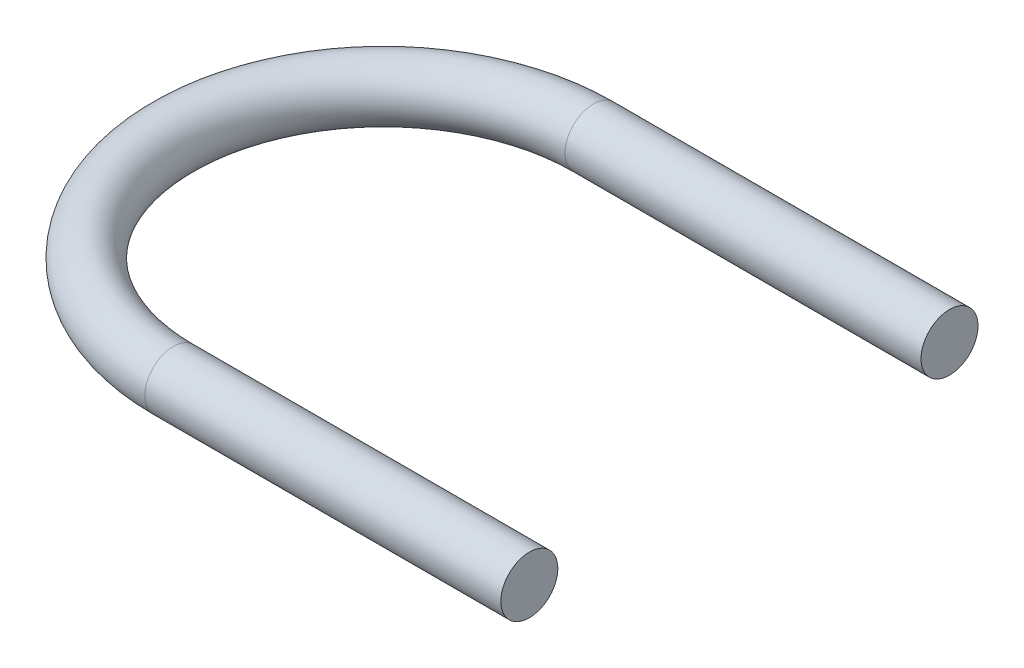
ISO-10303-21;
HEADER;
FILE_DESCRIPTION(('STEP AP214'),'2;1');
FILE_NAME('part.step','',(''),(''),'','','');
FILE_SCHEMA(('AUTOMOTIVE_DESIGN { 1 0 10303 214 1 1 1 1 }'));
ENDSEC;
DATA;
#1=APPLICATION_CONTEXT('core data for automotive mechanical design processes');
#2=APPLICATION_PROTOCOL_DEFINITION('international standard','automotive_design',2000,#1);
#3=PRODUCT_CONTEXT('',#1,'mechanical');
#4=PRODUCT('Part','Part','',(#3));
#5=PRODUCT_RELATED_PRODUCT_CATEGORY('part','',(#4));
#6=PRODUCT_DEFINITION_FORMATION('','',#4);
#7=PRODUCT_DEFINITION_CONTEXT('part definition',#1,'design');
#8=PRODUCT_DEFINITION('design','',#6,#7);
#9=PRODUCT_DEFINITION_SHAPE('','',#8);
#10=(LENGTH_UNIT() NAMED_UNIT(*) SI_UNIT(.MILLI.,.METRE.));
#11=(NAMED_UNIT(*) PLANE_ANGLE_UNIT() SI_UNIT($,.RADIAN.));
#12=(NAMED_UNIT(*) SI_UNIT($,.STERADIAN.) SOLID_ANGLE_UNIT());
#13=UNCERTAINTY_MEASURE_WITH_UNIT(LENGTH_MEASURE(1.E-05),#10,'distance_accuracy_value','');
#14=(GEOMETRIC_REPRESENTATION_CONTEXT(3) GLOBAL_UNCERTAINTY_ASSIGNED_CONTEXT((#13)) GLOBAL_UNIT_ASSIGNED_CONTEXT((#10,
#11,#12)) REPRESENTATION_CONTEXT('',''));
#15=CARTESIAN_POINT('',(0.,0.,0.));
#16=DIRECTION('',(0.,0.,1.));
#17=DIRECTION('',(1.,0.,0.));
#18=AXIS2_PLACEMENT_3D('',#15,#16,#17);
#19=CARTESIAN_POINT('',(50.,0.,-29.5));
#20=DIRECTION('',(1.,0.,0.));
#21=DIRECTION('',(0.,0.,-1.));
#22=AXIS2_PLACEMENT_3D('',#19,#20,#21);
#23=PLANE('',#22);
#24=CARTESIAN_POINT('',(50.,0.,-29.5));
#25=DIRECTION('',(1.,0.,0.));
#26=DIRECTION('',(0.,0.,-1.));
#27=AXIS2_PLACEMENT_3D('',#24,#25,#26);
#28=CIRCLE('',#27,4.);
#29=CARTESIAN_POINT('',(50.,0.,-33.5));
#30=VERTEX_POINT('',#29);
#31=EDGE_CURVE('E59',#30,#30,#28,.T.);
#32=ORIENTED_EDGE('',*,*,#31,.T.);
#33=EDGE_LOOP('',(#32));
#34=FACE_BOUND('',#33,.T.);
#35=ADVANCED_FACE('F47',(#34),#23,.T.);
#36=CARTESIAN_POINT('',(50.,0.,29.5));
#37=DIRECTION('',(-1.,0.,0.));
#38=DIRECTION('',(0.,0.,1.));
#39=AXIS2_PLACEMENT_3D('',#36,#37,#38);
#40=PLANE('',#39);
#41=CARTESIAN_POINT('',(50.,0.,29.5));
#42=DIRECTION('',(-1.,0.,0.));
#43=DIRECTION('',(0.,0.,1.));
#44=AXIS2_PLACEMENT_3D('',#41,#42,#43);
#45=CIRCLE('',#44,4.);
#46=CARTESIAN_POINT('',(50.,0.,33.5));
#47=VERTEX_POINT('',#46);
#48=EDGE_CURVE('E12',#47,#47,#45,.T.);
#49=ORIENTED_EDGE('',*,*,#48,.F.);
#50=EDGE_LOOP('',(#49));
#51=FACE_BOUND('',#50,.T.);
#52=ADVANCED_FACE('F65',(#51),#40,.F.);
#53=CARTESIAN_POINT('',(50.,0.,-29.5));
#54=DIRECTION('',(-1.,0.,0.));
#55=DIRECTION('',(0.,0.,1.));
#56=AXIS2_PLACEMENT_3D('',#53,#54,#55);
#57=CYLINDRICAL_SURFACE('',#56,4.);
#58=CARTESIAN_POINT('',(0.,0.,-29.5));
#59=DIRECTION('',(1.,0.,0.));
#60=DIRECTION('',(0.,0.,-1.));
#61=AXIS2_PLACEMENT_3D('',#58,#59,#60);
#62=CIRCLE('',#61,4.);
#63=CARTESIAN_POINT('',(0.,0.,-33.5));
#64=VERTEX_POINT('',#63);
#65=EDGE_CURVE('E90',#64,#64,#62,.T.);
#66=ORIENTED_EDGE('',*,*,#65,.T.);
#67=EDGE_LOOP('',(#66));
#68=FACE_BOUND('',#67,.T.);
#69=ORIENTED_EDGE('',*,*,#31,.F.);
#70=EDGE_LOOP('',(#69));
#71=FACE_BOUND('',#70,.T.);
#72=ADVANCED_FACE('F67',(#68,#71),#57,.T.);
#73=CARTESIAN_POINT('',(0.,0.,0.));
#74=DIRECTION('',(0.,1.,0.));
#75=DIRECTION('',(0.,0.,1.));
#76=AXIS2_PLACEMENT_3D('',#73,#74,#75);
#77=TOROIDAL_SURFACE('',#76,29.5,4.);
#78=CARTESIAN_POINT('',(0.,0.,29.5));
#79=DIRECTION('',(-1.,0.,0.));
#80=DIRECTION('',(0.,0.,1.));
#81=AXIS2_PLACEMENT_3D('',#78,#79,#80);
#82=CIRCLE('',#81,4.);
#83=CARTESIAN_POINT('',(0.,0.,33.5));
#84=VERTEX_POINT('',#83);
#85=EDGE_CURVE('E54',#84,#84,#82,.T.);
#86=CARTESIAN_POINT('',(0.,0.,0.));
#87=DIRECTION('',(0.,1.,0.));
#88=DIRECTION('',(0.,0.,1.));
#89=AXIS2_PLACEMENT_3D('',#86,#87,#88);
#90=CIRCLE('',#89,33.5);
#91=EDGE_CURVE('',#64,#84,#90,.T.);
#92=ORIENTED_EDGE('',*,*,#65,.F.);
#93=ORIENTED_EDGE('',*,*,#85,.T.);
#94=ORIENTED_EDGE('',*,*,#91,.T.);
#95=ORIENTED_EDGE('',*,*,#91,.F.);
#96=EDGE_LOOP('',(#92,#94,#93,#95));
#97=FACE_BOUND('',#96,.T.);
#98=ADVANCED_FACE('F72',(#97),#77,.T.);
#99=CARTESIAN_POINT('',(0.,0.,29.5));
#100=DIRECTION('',(1.,0.,0.));
#101=DIRECTION('',(0.,0.,-1.));
#102=AXIS2_PLACEMENT_3D('',#99,#100,#101);
#103=CYLINDRICAL_SURFACE('',#102,4.);
#104=ORIENTED_EDGE('',*,*,#48,.T.);
#105=EDGE_LOOP('',(#104));
#106=FACE_BOUND('',#105,.T.);
#107=ORIENTED_EDGE('',*,*,#85,.F.);
#108=EDGE_LOOP('',(#107));
#109=FACE_BOUND('',#108,.T.);
#110=ADVANCED_FACE('F62',(#106,#109),#103,.T.);
#111=CLOSED_SHELL('',(#35,#52,#72,#98,#110));
#112=MANIFOLD_SOLID_BREP('B2',#111);
#113=ADVANCED_BREP_SHAPE_REPRESENTATION('',(#18,#112),#14);
#114=SHAPE_DEFINITION_REPRESENTATION(#9,#113);
ENDSEC;
END-ISO-10303-21;
